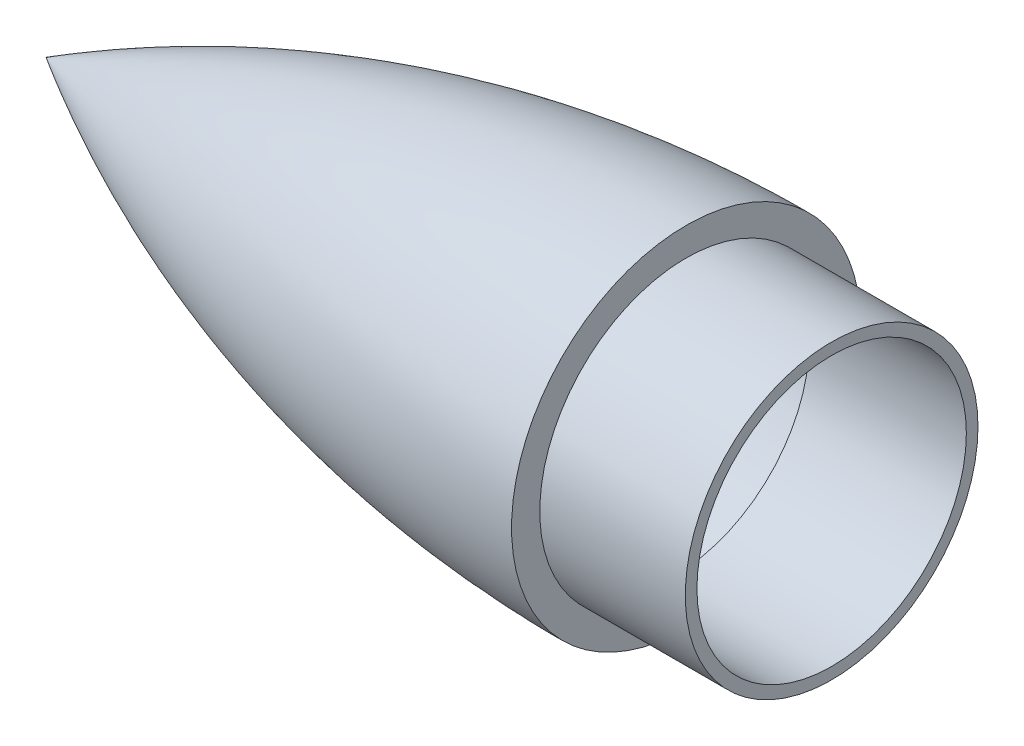
ISO-10303-21;
HEADER;
FILE_DESCRIPTION(('STEP AP214'),'2;1');
FILE_NAME('part.step','',(''),(''),'','','');
FILE_SCHEMA(('AUTOMOTIVE_DESIGN { 1 0 10303 214 1 1 1 1 }'));
ENDSEC;
DATA;
#1=APPLICATION_CONTEXT('core data for automotive mechanical design processes');
#2=APPLICATION_PROTOCOL_DEFINITION('international standard','automotive_design',2000,#1);
#3=PRODUCT_CONTEXT('',#1,'mechanical');
#4=PRODUCT('Part','Part','',(#3));
#5=PRODUCT_RELATED_PRODUCT_CATEGORY('part','',(#4));
#6=PRODUCT_DEFINITION_FORMATION('','',#4);
#7=PRODUCT_DEFINITION_CONTEXT('part definition',#1,'design');
#8=PRODUCT_DEFINITION('design','',#6,#7);
#9=PRODUCT_DEFINITION_SHAPE('','',#8);
#10=(LENGTH_UNIT() NAMED_UNIT(*) SI_UNIT(.MILLI.,.METRE.));
#11=(NAMED_UNIT(*) PLANE_ANGLE_UNIT() SI_UNIT($,.RADIAN.));
#12=(NAMED_UNIT(*) SI_UNIT($,.STERADIAN.) SOLID_ANGLE_UNIT());
#13=UNCERTAINTY_MEASURE_WITH_UNIT(LENGTH_MEASURE(1.E-05),#10,'distance_accuracy_value','');
#14=(GEOMETRIC_REPRESENTATION_CONTEXT(3) GLOBAL_UNCERTAINTY_ASSIGNED_CONTEXT((#13)) GLOBAL_UNIT_ASSIGNED_CONTEXT((#10,
#11,#12)) REPRESENTATION_CONTEXT('',''));
#15=CARTESIAN_POINT('',(0.,0.,0.));
#16=DIRECTION('',(0.,0.,1.));
#17=DIRECTION('',(1.,0.,0.));
#18=AXIS2_PLACEMENT_3D('',#15,#16,#17);
#19=CARTESIAN_POINT('',(0.,186.6666,186.6666));
#20=DIRECTION('',(0.,-1.,0.));
#21=DIRECTION('',(0.,0.,-1.));
#22=AXIS2_PLACEMENT_3D('',#19,#20,#21);
#23=CIRCLE('',#22,216.6666);
#24=TRIMMED_CURVE('',#23,(PARAMETER_VALUE(-0.532504182217954)),
(PARAMETER_VALUE(0.532504182217954)),.T.,.PARAMETER.);
#25=CARTESIAN_POINT('',(0.,186.6666,0.));
#26=DIRECTION('',(1.,0.,0.));
#27=AXIS1_PLACEMENT('',#25,#26);
#28=SURFACE_OF_REVOLUTION('',#24,#27);
#29=CARTESIAN_POINT('',(-109.99998181818,186.6666,0.));
#30=VERTEX_POINT('',#29);
#31=VERTEX_LOOP('',#30);
#32=FACE_BOUND('',#31,.T.);
#33=CARTESIAN_POINT('',(0.,186.6666,0.));
#34=DIRECTION('',(1.,0.,0.));
#35=DIRECTION('',(0.,0.,-1.));
#36=AXIS2_PLACEMENT_3D('',#33,#34,#35);
#37=CIRCLE('',#36,30.);
#38=CARTESIAN_POINT('',(0.,186.6666,-30.));
#39=VERTEX_POINT('',#38);
#40=EDGE_CURVE('E11',#39,#39,#37,.T.);
#41=ORIENTED_EDGE('',*,*,#40,.F.);
#42=EDGE_LOOP('',(#41));
#43=FACE_BOUND('',#42,.T.);
#44=ADVANCED_FACE('F41',(#32,#43),#28,.T.);
#45=CARTESIAN_POINT('',(0.,216.6666,0.));
#46=DIRECTION('',(1.,0.,0.));
#47=DIRECTION('',(0.,0.,-1.));
#48=AXIS2_PLACEMENT_3D('',#45,#46,#47);
#49=PLANE('',#48);
#50=CARTESIAN_POINT('',(0.,186.6666,0.));
#51=DIRECTION('',(1.,0.,0.));
#52=DIRECTION('',(0.,0.,-1.));
#53=AXIS2_PLACEMENT_3D('',#50,#51,#52);
#54=CIRCLE('',#53,25.15);
#55=CARTESIAN_POINT('',(0.,186.6666,-25.15));
#56=VERTEX_POINT('',#55);
#57=EDGE_CURVE('E66',#56,#56,#54,.T.);
#58=ORIENTED_EDGE('',*,*,#57,.F.);
#59=EDGE_LOOP('',(#58));
#60=FACE_BOUND('',#59,.T.);
#61=ORIENTED_EDGE('',*,*,#40,.T.);
#62=EDGE_LOOP('',(#61));
#63=FACE_BOUND('',#62,.T.);
#64=ADVANCED_FACE('F87',(#60,#63),#49,.T.);
#65=CARTESIAN_POINT('',(25.,186.6666,0.));
#66=DIRECTION('',(-1.,0.,0.));
#67=DIRECTION('',(0.,0.,1.));
#68=AXIS2_PLACEMENT_3D('',#65,#66,#67);
#69=CYLINDRICAL_SURFACE('',#68,25.15);
#70=CARTESIAN_POINT('',(25.,186.6666,0.));
#71=DIRECTION('',(1.,0.,0.));
#72=DIRECTION('',(0.,0.,-1.));
#73=AXIS2_PLACEMENT_3D('',#70,#71,#72);
#74=CIRCLE('',#73,25.15);
#75=CARTESIAN_POINT('',(25.,186.6666,-25.15));
#76=VERTEX_POINT('',#75);
#77=EDGE_CURVE('E49',#76,#76,#74,.T.);
#78=ORIENTED_EDGE('',*,*,#77,.F.);
#79=EDGE_LOOP('',(#78));
#80=FACE_BOUND('',#79,.T.);
#81=ORIENTED_EDGE('',*,*,#57,.T.);
#82=EDGE_LOOP('',(#81));
#83=FACE_BOUND('',#82,.T.);
#84=ADVANCED_FACE('F84',(#80,#83),#69,.T.);
#85=CARTESIAN_POINT('',(25.,186.6666,0.));
#86=DIRECTION('',(1.,0.,0.));
#87=DIRECTION('',(0.,0.,-1.));
#88=AXIS2_PLACEMENT_3D('',#85,#86,#87);
#89=PLANE('',#88);
#90=CARTESIAN_POINT('',(25.,186.6666,0.));
#91=DIRECTION('',(1.,0.,0.));
#92=DIRECTION('',(0.,0.,-1.));
#93=AXIS2_PLACEMENT_3D('',#90,#91,#92);
#94=CIRCLE('',#93,23.15);
#95=CARTESIAN_POINT('',(25.,186.6666,-23.15));
#96=VERTEX_POINT('',#95);
#97=EDGE_CURVE('E67',#96,#96,#94,.T.);
#98=ORIENTED_EDGE('',*,*,#97,.F.);
#99=EDGE_LOOP('',(#98));
#100=FACE_BOUND('',#99,.T.);
#101=ORIENTED_EDGE('',*,*,#77,.T.);
#102=EDGE_LOOP('',(#101));
#103=FACE_BOUND('',#102,.T.);
#104=ADVANCED_FACE('F59',(#100,#103),#89,.T.);
#105=CARTESIAN_POINT('',(0.,186.6666,186.6666));
#106=DIRECTION('',(0.,-1.,0.));
#107=DIRECTION('',(0.,0.,-1.));
#108=AXIS2_PLACEMENT_3D('',#105,#106,#107);
#109=CIRCLE('',#108,214.6666);
#110=TRIMMED_CURVE('',#109,(PARAMETER_VALUE(-0.516475222876483)),
(PARAMETER_VALUE(0.516475222876483)),.T.,.PARAMETER.);
#111=CARTESIAN_POINT('',(0.,186.6666,0.));
#112=DIRECTION('',(1.,0.,0.));
#113=AXIS1_PLACEMENT('',#111,#112);
#114=SURFACE_OF_REVOLUTION('',#110,#113);
#115=CARTESIAN_POINT('',(-106.006271512586,186.6666,0.));
#116=VERTEX_POINT('',#115);
#117=VERTEX_LOOP('',#116);
#118=FACE_BOUND('',#117,.T.);
#119=CARTESIAN_POINT('',(-2.,186.6666,0.));
#120=DIRECTION('',(1.,0.,0.));
#121=DIRECTION('',(0.,0.,-1.));
#122=AXIS2_PLACEMENT_3D('',#119,#120,#121);
#123=CIRCLE('',#122,27.9906830247323);
#124=CARTESIAN_POINT('',(-2.,186.6666,-27.9906830247323));
#125=VERTEX_POINT('',#124);
#126=EDGE_CURVE('E63',#125,#125,#123,.T.);
#127=ORIENTED_EDGE('',*,*,#126,.T.);
#128=EDGE_LOOP('',(#127));
#129=FACE_BOUND('',#128,.T.);
#130=ADVANCED_FACE('F55',(#118,#129),#114,.F.);
#131=CARTESIAN_POINT('',(-2.,216.6666,0.));
#132=DIRECTION('',(1.,0.,0.));
#133=DIRECTION('',(0.,0.,-1.));
#134=AXIS2_PLACEMENT_3D('',#131,#132,#133);
#135=PLANE('',#134);
#136=CARTESIAN_POINT('',(-2.,186.6666,0.));
#137=DIRECTION('',(1.,0.,0.));
#138=DIRECTION('',(0.,0.,-1.));
#139=AXIS2_PLACEMENT_3D('',#136,#137,#138);
#140=CIRCLE('',#139,23.15);
#141=CARTESIAN_POINT('',(-2.,186.6666,-23.15));
#142=VERTEX_POINT('',#141);
#143=EDGE_CURVE('E73',#142,#142,#140,.T.);
#144=ORIENTED_EDGE('',*,*,#143,.T.);
#145=EDGE_LOOP('',(#144));
#146=FACE_BOUND('',#145,.T.);
#147=ORIENTED_EDGE('',*,*,#126,.F.);
#148=EDGE_LOOP('',(#147));
#149=FACE_BOUND('',#148,.T.);
#150=ADVANCED_FACE('F58',(#146,#149),#135,.F.);
#151=CARTESIAN_POINT('',(25.,186.6666,0.));
#152=DIRECTION('',(-1.,0.,0.));
#153=DIRECTION('',(0.,0.,1.));
#154=AXIS2_PLACEMENT_3D('',#151,#152,#153);
#155=CYLINDRICAL_SURFACE('',#154,23.15);
#156=ORIENTED_EDGE('',*,*,#97,.T.);
#157=EDGE_LOOP('',(#156));
#158=FACE_BOUND('',#157,.T.);
#159=ORIENTED_EDGE('',*,*,#143,.F.);
#160=EDGE_LOOP('',(#159));
#161=FACE_BOUND('',#160,.T.);
#162=ADVANCED_FACE('F123',(#158,#161),#155,.F.);
#163=CLOSED_SHELL('',(#44,#64,#84,#104,#130,#150,#162));
#164=MANIFOLD_SOLID_BREP('B2',#163);
#165=ADVANCED_BREP_SHAPE_REPRESENTATION('',(#18,#164),#14);
#166=SHAPE_DEFINITION_REPRESENTATION(#9,#165);
ENDSEC;
END-ISO-10303-21;
